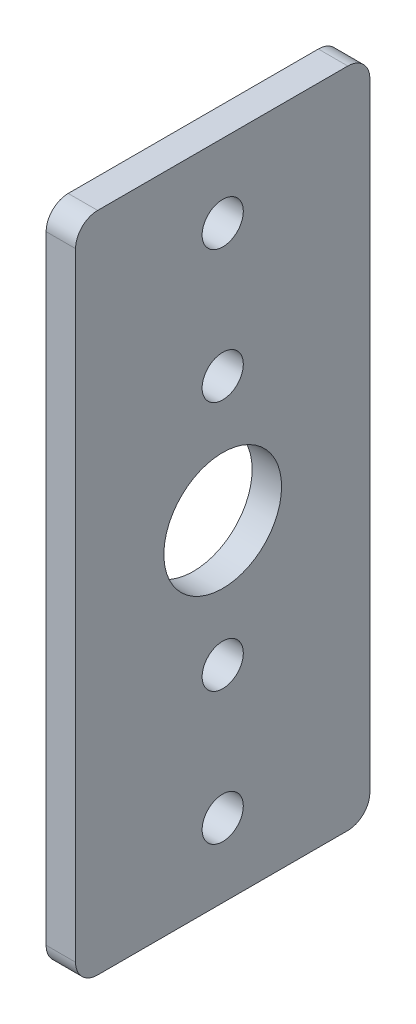
ISO-10303-21;
HEADER;
FILE_DESCRIPTION(('STEP AP214'),'2;1');
FILE_NAME('part.step','',(''),(''),'','','');
FILE_SCHEMA(('AUTOMOTIVE_DESIGN { 1 0 10303 214 1 1 1 1 }'));
ENDSEC;
DATA;
#1=APPLICATION_CONTEXT('core data for automotive mechanical design processes');
#2=APPLICATION_PROTOCOL_DEFINITION('international standard','automotive_design',2000,#1);
#3=PRODUCT_CONTEXT('',#1,'mechanical');
#4=PRODUCT('Part','Part','',(#3));
#5=PRODUCT_RELATED_PRODUCT_CATEGORY('part','',(#4));
#6=PRODUCT_DEFINITION_FORMATION('','',#4);
#7=PRODUCT_DEFINITION_CONTEXT('part definition',#1,'design');
#8=PRODUCT_DEFINITION('design','',#6,#7);
#9=PRODUCT_DEFINITION_SHAPE('','',#8);
#10=(LENGTH_UNIT() NAMED_UNIT(*) SI_UNIT(.MILLI.,.METRE.));
#11=(NAMED_UNIT(*) PLANE_ANGLE_UNIT() SI_UNIT($,.RADIAN.));
#12=(NAMED_UNIT(*) SI_UNIT($,.STERADIAN.) SOLID_ANGLE_UNIT());
#13=UNCERTAINTY_MEASURE_WITH_UNIT(LENGTH_MEASURE(1.E-05),#10,'distance_accuracy_value','');
#14=(GEOMETRIC_REPRESENTATION_CONTEXT(3) GLOBAL_UNCERTAINTY_ASSIGNED_CONTEXT((#13)) GLOBAL_UNIT_ASSIGNED_CONTEXT((#10,
#11,#12)) REPRESENTATION_CONTEXT('',''));
#15=CARTESIAN_POINT('',(0.,0.,0.));
#16=DIRECTION('',(0.,0.,1.));
#17=DIRECTION('',(1.,0.,0.));
#18=AXIS2_PLACEMENT_3D('',#15,#16,#17);
#19=CARTESIAN_POINT('',(2.,0.,0.));
#20=DIRECTION('',(1.,0.,0.));
#21=DIRECTION('',(0.,0.,-1.));
#22=AXIS2_PLACEMENT_3D('',#19,#20,#21);
#23=PLANE('',#22);
#24=CARTESIAN_POINT('',(2.,-72.2566119046528,-0.605906027952761));
#25=DIRECTION('',(1.,0.,0.));
#26=DIRECTION('',(0.,0.,-1.));
#27=AXIS2_PLACEMENT_3D('',#24,#25,#26);
#28=CIRCLE('',#27,1.4);
#29=CARTESIAN_POINT('',(2.,-72.2566119046528,-2.00590602795276));
#30=VERTEX_POINT('',#29);
#31=EDGE_CURVE('E190',#30,#30,#28,.T.);
#32=ORIENTED_EDGE('',*,*,#31,.F.);
#33=EDGE_LOOP('',(#32));
#34=FACE_BOUND('',#33,.T.);
#35=CARTESIAN_POINT('',(2.,-46.2566119046528,-0.605906027952761));
#36=DIRECTION('',(1.,0.,0.));
#37=DIRECTION('',(0.,0.,-1.));
#38=AXIS2_PLACEMENT_3D('',#35,#36,#37);
#39=CIRCLE('',#38,1.4);
#40=CARTESIAN_POINT('',(2.,-46.2566119046528,-2.00590602795276));
#41=VERTEX_POINT('',#40);
#42=EDGE_CURVE('E179',#41,#41,#39,.T.);
#43=ORIENTED_EDGE('',*,*,#42,.F.);
#44=EDGE_LOOP('',(#43));
#45=FACE_BOUND('',#44,.T.);
#46=DIRECTION('',(0.,1.,0.));
#47=VECTOR('',#46,1.);
#48=CARTESIAN_POINT('',(2.,-41.2566119046528,-10.6059060279527));
#49=LINE('',#48,#47);
#50=CARTESIAN_POINT('',(2.,-84.7566119046528,-10.6059060279527));
#51=VERTEX_POINT('',#50);
#52=CARTESIAN_POINT('',(2.,-42.7566119046528,-10.6059060279527));
#53=VERTEX_POINT('',#52);
#54=EDGE_CURVE('E174',#51,#53,#49,.T.);
#55=ORIENTED_EDGE('',*,*,#54,.T.);
#56=CARTESIAN_POINT('',(2.,-42.7566119046528,-9.10590602795275));
#57=DIRECTION('',(1.,0.,0.));
#58=DIRECTION('',(0.,0.,-1.));
#59=AXIS2_PLACEMENT_3D('',#56,#57,#58);
#60=CIRCLE('',#59,1.5);
#61=CARTESIAN_POINT('',(2.,-41.2566119046528,-9.10590602795274));
#62=VERTEX_POINT('',#61);
#63=EDGE_CURVE('E151',#53,#62,#60,.T.);
#64=ORIENTED_EDGE('',*,*,#63,.T.);
#65=DIRECTION('',(0.,0.,1.));
#66=VECTOR('',#65,1.);
#67=CARTESIAN_POINT('',(2.,-41.2566119046528,9.39409397204723));
#68=LINE('',#67,#66);
#69=CARTESIAN_POINT('',(2.,-41.2566119046528,7.89409397204723));
#70=VERTEX_POINT('',#69);
#71=EDGE_CURVE('E122',#62,#70,#68,.T.);
#72=ORIENTED_EDGE('',*,*,#71,.T.);
#73=CARTESIAN_POINT('',(2.,-42.7566119046528,7.89409397204723));
#74=DIRECTION('',(1.,0.,0.));
#75=DIRECTION('',(0.,0.,-1.));
#76=AXIS2_PLACEMENT_3D('',#73,#74,#75);
#77=CIRCLE('',#76,1.5);
#78=CARTESIAN_POINT('',(2.,-42.7566119046528,9.39409397204723));
#79=VERTEX_POINT('',#78);
#80=EDGE_CURVE('E149',#70,#79,#77,.T.);
#81=ORIENTED_EDGE('',*,*,#80,.T.);
#82=DIRECTION('',(0.,-1.,0.));
#83=VECTOR('',#82,1.);
#84=CARTESIAN_POINT('',(2.,-41.2566119046528,9.39409397204723));
#85=LINE('',#84,#83);
#86=CARTESIAN_POINT('',(2.,-84.7566119046528,9.39409397204723));
#87=VERTEX_POINT('',#86);
#88=EDGE_CURVE('E129',#79,#87,#85,.T.);
#89=ORIENTED_EDGE('',*,*,#88,.T.);
#90=CARTESIAN_POINT('',(2.,-84.7566119046528,7.89409397204723));
#91=DIRECTION('',(1.,0.,0.));
#92=DIRECTION('',(0.,0.,-1.));
#93=AXIS2_PLACEMENT_3D('',#90,#91,#92);
#94=CIRCLE('',#93,1.5);
#95=CARTESIAN_POINT('',(2.,-86.2566119046528,7.89409397204723));
#96=VERTEX_POINT('',#95);
#97=EDGE_CURVE('E57',#87,#96,#94,.T.);
#98=ORIENTED_EDGE('',*,*,#97,.T.);
#99=DIRECTION('',(0.,0.,-1.));
#100=VECTOR('',#99,1.);
#101=CARTESIAN_POINT('',(2.,-86.2566119046528,9.39409397204723));
#102=LINE('',#101,#100);
#103=CARTESIAN_POINT('',(2.,-86.2566119046528,-9.10590602795274));
#104=VERTEX_POINT('',#103);
#105=EDGE_CURVE('E132',#96,#104,#102,.T.);
#106=ORIENTED_EDGE('',*,*,#105,.T.);
#107=CARTESIAN_POINT('',(2.,-84.7566119046528,-9.10590602795275));
#108=DIRECTION('',(1.,0.,0.));
#109=DIRECTION('',(0.,0.,-1.));
#110=AXIS2_PLACEMENT_3D('',#107,#108,#109);
#111=CIRCLE('',#110,1.5);
#112=EDGE_CURVE('E146',#104,#51,#111,.T.);
#113=ORIENTED_EDGE('',*,*,#112,.T.);
#114=EDGE_LOOP('',(#55,#64,#72,#81,#89,#98,#106,#113));
#115=FACE_BOUND('',#114,.T.);
#116=CARTESIAN_POINT('',(2.,-63.7566119046528,-0.605906027952761));
#117=DIRECTION('',(1.,0.,0.));
#118=DIRECTION('',(0.,0.,-1.));
#119=AXIS2_PLACEMENT_3D('',#116,#117,#118);
#120=CIRCLE('',#119,4.);
#121=CARTESIAN_POINT('',(2.,-63.7566119046528,-4.60590602795276));
#122=VERTEX_POINT('',#121);
#123=EDGE_CURVE('E167',#122,#122,#120,.T.);
#124=ORIENTED_EDGE('',*,*,#123,.F.);
#125=EDGE_LOOP('',(#124));
#126=FACE_BOUND('',#125,.T.);
#127=CARTESIAN_POINT('',(2.,-55.2566119046528,-0.605906027952761));
#128=DIRECTION('',(1.,0.,0.));
#129=DIRECTION('',(0.,0.,-1.));
#130=AXIS2_PLACEMENT_3D('',#127,#128,#129);
#131=CIRCLE('',#130,1.4);
#132=CARTESIAN_POINT('',(2.,-55.2566119046528,-2.00590602795276));
#133=VERTEX_POINT('',#132);
#134=EDGE_CURVE('E184',#133,#133,#131,.T.);
#135=ORIENTED_EDGE('',*,*,#134,.F.);
#136=EDGE_LOOP('',(#135));
#137=FACE_BOUND('',#136,.T.);
#138=CARTESIAN_POINT('',(2.,-81.2566119046528,-0.605906027952761));
#139=DIRECTION('',(1.,0.,0.));
#140=DIRECTION('',(0.,0.,-1.));
#141=AXIS2_PLACEMENT_3D('',#138,#139,#140);
#142=CIRCLE('',#141,1.4);
#143=CARTESIAN_POINT('',(2.,-81.2566119046528,-2.00590602795276));
#144=VERTEX_POINT('',#143);
#145=EDGE_CURVE('E196',#144,#144,#142,.T.);
#146=ORIENTED_EDGE('',*,*,#145,.F.);
#147=EDGE_LOOP('',(#146));
#148=FACE_BOUND('',#147,.T.);
#149=ADVANCED_FACE('F36',(#34,#45,#115,#126,#137,#148),#23,.T.);
#150=CARTESIAN_POINT('',(0.,0.,0.));
#151=DIRECTION('',(1.,0.,0.));
#152=DIRECTION('',(0.,0.,-1.));
#153=AXIS2_PLACEMENT_3D('',#150,#151,#152);
#154=PLANE('',#153);
#155=DIRECTION('',(0.,0.,1.));
#156=VECTOR('',#155,1.);
#157=CARTESIAN_POINT('',(0.,-41.2566119046528,9.39409397204723));
#158=LINE('',#157,#156);
#159=CARTESIAN_POINT('',(0.,-41.2566119046528,-9.10590602795274));
#160=VERTEX_POINT('',#159);
#161=CARTESIAN_POINT('',(0.,-41.2566119046528,7.89409397204723));
#162=VERTEX_POINT('',#161);
#163=EDGE_CURVE('E119',#160,#162,#158,.T.);
#164=ORIENTED_EDGE('',*,*,#163,.F.);
#165=CARTESIAN_POINT('',(0.,-42.7566119046528,-9.10590602795275));
#166=DIRECTION('',(1.,0.,0.));
#167=DIRECTION('',(0.,0.,-1.));
#168=AXIS2_PLACEMENT_3D('',#165,#166,#167);
#169=CIRCLE('',#168,1.5);
#170=CARTESIAN_POINT('',(0.,-42.7566119046528,-10.6059060279527));
#171=VERTEX_POINT('',#170);
#172=EDGE_CURVE('E102',#160,#171,#169,.F.);
#173=ORIENTED_EDGE('',*,*,#172,.T.);
#174=DIRECTION('',(0.,1.,0.));
#175=VECTOR('',#174,1.);
#176=CARTESIAN_POINT('',(0.,-41.2566119046528,-10.6059060279527));
#177=LINE('',#176,#175);
#178=CARTESIAN_POINT('',(0.,-84.7566119046528,-10.6059060279527));
#179=VERTEX_POINT('',#178);
#180=EDGE_CURVE('E130',#179,#171,#177,.T.);
#181=ORIENTED_EDGE('',*,*,#180,.F.);
#182=CARTESIAN_POINT('',(0.,-84.7566119046528,-9.10590602795275));
#183=DIRECTION('',(1.,0.,0.));
#184=DIRECTION('',(0.,0.,-1.));
#185=AXIS2_PLACEMENT_3D('',#182,#183,#184);
#186=CIRCLE('',#185,1.5);
#187=CARTESIAN_POINT('',(0.,-86.2566119046528,-9.10590602795274));
#188=VERTEX_POINT('',#187);
#189=EDGE_CURVE('E123',#179,#188,#186,.F.);
#190=ORIENTED_EDGE('',*,*,#189,.T.);
#191=DIRECTION('',(0.,0.,-1.));
#192=VECTOR('',#191,1.);
#193=CARTESIAN_POINT('',(0.,-86.2566119046528,9.39409397204723));
#194=LINE('',#193,#192);
#195=CARTESIAN_POINT('',(0.,-86.2566119046528,7.89409397204723));
#196=VERTEX_POINT('',#195);
#197=EDGE_CURVE('E134',#196,#188,#194,.T.);
#198=ORIENTED_EDGE('',*,*,#197,.F.);
#199=CARTESIAN_POINT('',(0.,-84.7566119046528,7.89409397204723));
#200=DIRECTION('',(1.,0.,0.));
#201=DIRECTION('',(0.,0.,-1.));
#202=AXIS2_PLACEMENT_3D('',#199,#200,#201);
#203=CIRCLE('',#202,1.5);
#204=CARTESIAN_POINT('',(0.,-84.7566119046528,9.39409397204723));
#205=VERTEX_POINT('',#204);
#206=EDGE_CURVE('E140',#196,#205,#203,.F.);
#207=ORIENTED_EDGE('',*,*,#206,.T.);
#208=DIRECTION('',(0.,-1.,0.));
#209=VECTOR('',#208,1.);
#210=CARTESIAN_POINT('',(0.,-41.2566119046528,9.39409397204723));
#211=LINE('',#210,#209);
#212=CARTESIAN_POINT('',(0.,-42.7566119046528,9.39409397204723));
#213=VERTEX_POINT('',#212);
#214=EDGE_CURVE('E162',#213,#205,#211,.T.);
#215=ORIENTED_EDGE('',*,*,#214,.F.);
#216=CARTESIAN_POINT('',(0.,-42.7566119046528,7.89409397204723));
#217=DIRECTION('',(1.,0.,0.));
#218=DIRECTION('',(0.,0.,-1.));
#219=AXIS2_PLACEMENT_3D('',#216,#217,#218);
#220=CIRCLE('',#219,1.5);
#221=EDGE_CURVE('E113',#213,#162,#220,.F.);
#222=ORIENTED_EDGE('',*,*,#221,.T.);
#223=EDGE_LOOP('',(#164,#173,#181,#190,#198,#207,#215,#222));
#224=FACE_BOUND('',#223,.T.);
#225=CARTESIAN_POINT('',(0.,-63.7566119046528,-0.605906027952761));
#226=DIRECTION('',(1.,0.,0.));
#227=DIRECTION('',(0.,0.,-1.));
#228=AXIS2_PLACEMENT_3D('',#225,#226,#227);
#229=CIRCLE('',#228,4.);
#230=CARTESIAN_POINT('',(0.,-63.7566119046528,-4.60590602795276));
#231=VERTEX_POINT('',#230);
#232=EDGE_CURVE('E170',#231,#231,#229,.T.);
#233=ORIENTED_EDGE('',*,*,#232,.T.);
#234=EDGE_LOOP('',(#233));
#235=FACE_BOUND('',#234,.T.);
#236=CARTESIAN_POINT('',(0.,-46.2566119046528,-0.605906027952761));
#237=DIRECTION('',(1.,0.,0.));
#238=DIRECTION('',(0.,0.,-1.));
#239=AXIS2_PLACEMENT_3D('',#236,#237,#238);
#240=CIRCLE('',#239,1.4);
#241=CARTESIAN_POINT('',(0.,-46.2566119046528,-2.00590602795276));
#242=VERTEX_POINT('',#241);
#243=EDGE_CURVE('E181',#242,#242,#240,.T.);
#244=ORIENTED_EDGE('',*,*,#243,.T.);
#245=EDGE_LOOP('',(#244));
#246=FACE_BOUND('',#245,.T.);
#247=CARTESIAN_POINT('',(0.,-55.2566119046528,-0.605906027952761));
#248=DIRECTION('',(1.,0.,0.));
#249=DIRECTION('',(0.,0.,-1.));
#250=AXIS2_PLACEMENT_3D('',#247,#248,#249);
#251=CIRCLE('',#250,1.4);
#252=CARTESIAN_POINT('',(0.,-55.2566119046528,-2.00590602795276));
#253=VERTEX_POINT('',#252);
#254=EDGE_CURVE('E187',#253,#253,#251,.T.);
#255=ORIENTED_EDGE('',*,*,#254,.T.);
#256=EDGE_LOOP('',(#255));
#257=FACE_BOUND('',#256,.T.);
#258=CARTESIAN_POINT('',(0.,-72.2566119046528,-0.605906027952761));
#259=DIRECTION('',(1.,0.,0.));
#260=DIRECTION('',(0.,0.,-1.));
#261=AXIS2_PLACEMENT_3D('',#258,#259,#260);
#262=CIRCLE('',#261,1.4);
#263=CARTESIAN_POINT('',(0.,-72.2566119046528,-2.00590602795276));
#264=VERTEX_POINT('',#263);
#265=EDGE_CURVE('E193',#264,#264,#262,.T.);
#266=ORIENTED_EDGE('',*,*,#265,.T.);
#267=EDGE_LOOP('',(#266));
#268=FACE_BOUND('',#267,.T.);
#269=CARTESIAN_POINT('',(0.,-81.2566119046528,-0.605906027952761));
#270=DIRECTION('',(1.,0.,0.));
#271=DIRECTION('',(0.,0.,-1.));
#272=AXIS2_PLACEMENT_3D('',#269,#270,#271);
#273=CIRCLE('',#272,1.4);
#274=CARTESIAN_POINT('',(0.,-81.2566119046528,-2.00590602795276));
#275=VERTEX_POINT('',#274);
#276=EDGE_CURVE('E199',#275,#275,#273,.T.);
#277=ORIENTED_EDGE('',*,*,#276,.T.);
#278=EDGE_LOOP('',(#277));
#279=FACE_BOUND('',#278,.T.);
#280=ADVANCED_FACE('F126',(#224,#235,#246,#257,#268,#279),#154,.F.);
#281=CARTESIAN_POINT('',(2.,-41.2566119046528,9.39409397204723));
#282=DIRECTION('',(0.,0.,-1.));
#283=DIRECTION('',(-1.,0.,0.));
#284=AXIS2_PLACEMENT_3D('',#281,#282,#283);
#285=PLANE('',#284);
#286=ORIENTED_EDGE('',*,*,#88,.F.);
#287=DIRECTION('',(-1.,0.,0.));
#288=VECTOR('',#287,1.);
#289=CARTESIAN_POINT('',(2.,-42.7566119046528,9.39409397204723));
#290=LINE('',#289,#288);
#291=EDGE_CURVE('E155',#79,#213,#290,.T.);
#292=ORIENTED_EDGE('',*,*,#291,.T.);
#293=ORIENTED_EDGE('',*,*,#214,.T.);
#294=DIRECTION('',(-1.,0.,0.));
#295=VECTOR('',#294,1.);
#296=CARTESIAN_POINT('',(2.,-84.7566119046528,9.39409397204723));
#297=LINE('',#296,#295);
#298=EDGE_CURVE('E153',#205,#87,#297,.F.);
#299=ORIENTED_EDGE('',*,*,#298,.T.);
#300=EDGE_LOOP('',(#286,#292,#293,#299));
#301=FACE_BOUND('',#300,.T.);
#302=ADVANCED_FACE('F161',(#301),#285,.F.);
#303=CARTESIAN_POINT('',(2.,-86.2566119046528,9.39409397204723));
#304=DIRECTION('',(0.,1.,0.));
#305=DIRECTION('',(0.,0.,1.));
#306=AXIS2_PLACEMENT_3D('',#303,#304,#305);
#307=PLANE('',#306);
#308=ORIENTED_EDGE('',*,*,#105,.F.);
#309=DIRECTION('',(-1.,0.,0.));
#310=VECTOR('',#309,1.);
#311=CARTESIAN_POINT('',(2.,-86.2566119046528,7.89409397204723));
#312=LINE('',#311,#310);
#313=EDGE_CURVE('E11',#96,#196,#312,.T.);
#314=ORIENTED_EDGE('',*,*,#313,.T.);
#315=ORIENTED_EDGE('',*,*,#197,.T.);
#316=DIRECTION('',(-1.,0.,0.));
#317=VECTOR('',#316,1.);
#318=CARTESIAN_POINT('',(2.,-86.2566119046528,-9.10590602795275));
#319=LINE('',#318,#317);
#320=EDGE_CURVE('E44',#188,#104,#319,.F.);
#321=ORIENTED_EDGE('',*,*,#320,.T.);
#322=EDGE_LOOP('',(#308,#314,#315,#321));
#323=FACE_BOUND('',#322,.T.);
#324=ADVANCED_FACE('F226',(#323),#307,.F.);
#325=CARTESIAN_POINT('',(2.,-41.2566119046528,-10.6059060279527));
#326=DIRECTION('',(0.,0.,1.));
#327=DIRECTION('',(1.,0.,0.));
#328=AXIS2_PLACEMENT_3D('',#325,#326,#327);
#329=PLANE('',#328);
#330=ORIENTED_EDGE('',*,*,#180,.T.);
#331=DIRECTION('',(-1.,0.,0.));
#332=VECTOR('',#331,1.);
#333=CARTESIAN_POINT('',(2.,-42.7566119046528,-10.6059060279527));
#334=LINE('',#333,#332);
#335=EDGE_CURVE('E107',#171,#53,#334,.F.);
#336=ORIENTED_EDGE('',*,*,#335,.T.);
#337=ORIENTED_EDGE('',*,*,#54,.F.);
#338=DIRECTION('',(-1.,0.,0.));
#339=VECTOR('',#338,1.);
#340=CARTESIAN_POINT('',(2.,-84.7566119046528,-10.6059060279527));
#341=LINE('',#340,#339);
#342=EDGE_CURVE('E112',#51,#179,#341,.T.);
#343=ORIENTED_EDGE('',*,*,#342,.T.);
#344=EDGE_LOOP('',(#330,#336,#337,#343));
#345=FACE_BOUND('',#344,.T.);
#346=ADVANCED_FACE('F223',(#345),#329,.F.);
#347=CARTESIAN_POINT('',(2.,-41.2566119046528,9.39409397204723));
#348=DIRECTION('',(0.,-1.,0.));
#349=DIRECTION('',(0.,0.,-1.));
#350=AXIS2_PLACEMENT_3D('',#347,#348,#349);
#351=PLANE('',#350);
#352=ORIENTED_EDGE('',*,*,#71,.F.);
#353=DIRECTION('',(-1.,0.,0.));
#354=VECTOR('',#353,1.);
#355=CARTESIAN_POINT('',(2.,-41.2566119046528,-9.10590602795275));
#356=LINE('',#355,#354);
#357=EDGE_CURVE('E106',#62,#160,#356,.T.);
#358=ORIENTED_EDGE('',*,*,#357,.T.);
#359=ORIENTED_EDGE('',*,*,#163,.T.);
#360=DIRECTION('',(-1.,0.,0.));
#361=VECTOR('',#360,1.);
#362=CARTESIAN_POINT('',(2.,-41.2566119046528,7.89409397204723));
#363=LINE('',#362,#361);
#364=EDGE_CURVE('E124',#162,#70,#363,.F.);
#365=ORIENTED_EDGE('',*,*,#364,.T.);
#366=EDGE_LOOP('',(#352,#358,#359,#365));
#367=FACE_BOUND('',#366,.T.);
#368=ADVANCED_FACE('F118',(#367),#351,.F.);
#369=CARTESIAN_POINT('',(2.,-63.7566119046528,-0.605906027952761));
#370=DIRECTION('',(-1.,0.,0.));
#371=DIRECTION('',(0.,0.,1.));
#372=AXIS2_PLACEMENT_3D('',#369,#370,#371);
#373=CYLINDRICAL_SURFACE('',#372,4.);
#374=ORIENTED_EDGE('',*,*,#123,.T.);
#375=EDGE_LOOP('',(#374));
#376=FACE_BOUND('',#375,.T.);
#377=ORIENTED_EDGE('',*,*,#232,.F.);
#378=EDGE_LOOP('',(#377));
#379=FACE_BOUND('',#378,.T.);
#380=ADVANCED_FACE('F218',(#376,#379),#373,.F.);
#381=CARTESIAN_POINT('',(2.,-46.2566119046528,-0.605906027952761));
#382=DIRECTION('',(-1.,0.,0.));
#383=DIRECTION('',(0.,0.,1.));
#384=AXIS2_PLACEMENT_3D('',#381,#382,#383);
#385=CYLINDRICAL_SURFACE('',#384,1.4);
#386=ORIENTED_EDGE('',*,*,#42,.T.);
#387=EDGE_LOOP('',(#386));
#388=FACE_BOUND('',#387,.T.);
#389=ORIENTED_EDGE('',*,*,#243,.F.);
#390=EDGE_LOOP('',(#389));
#391=FACE_BOUND('',#390,.T.);
#392=ADVANCED_FACE('F256',(#388,#391),#385,.F.);
#393=CARTESIAN_POINT('',(2.,-55.2566119046528,-0.605906027952761));
#394=DIRECTION('',(-1.,0.,0.));
#395=DIRECTION('',(0.,0.,1.));
#396=AXIS2_PLACEMENT_3D('',#393,#394,#395);
#397=CYLINDRICAL_SURFACE('',#396,1.4);
#398=ORIENTED_EDGE('',*,*,#134,.T.);
#399=EDGE_LOOP('',(#398));
#400=FACE_BOUND('',#399,.T.);
#401=ORIENTED_EDGE('',*,*,#254,.F.);
#402=EDGE_LOOP('',(#401));
#403=FACE_BOUND('',#402,.T.);
#404=ADVANCED_FACE('F252',(#400,#403),#397,.F.);
#405=CARTESIAN_POINT('',(2.,-72.2566119046528,-0.605906027952761));
#406=DIRECTION('',(-1.,0.,0.));
#407=DIRECTION('',(0.,0.,1.));
#408=AXIS2_PLACEMENT_3D('',#405,#406,#407);
#409=CYLINDRICAL_SURFACE('',#408,1.4);
#410=ORIENTED_EDGE('',*,*,#31,.T.);
#411=EDGE_LOOP('',(#410));
#412=FACE_BOUND('',#411,.T.);
#413=ORIENTED_EDGE('',*,*,#265,.F.);
#414=EDGE_LOOP('',(#413));
#415=FACE_BOUND('',#414,.T.);
#416=ADVANCED_FACE('F255',(#412,#415),#409,.F.);
#417=CARTESIAN_POINT('',(2.,-81.2566119046528,-0.605906027952761));
#418=DIRECTION('',(-1.,0.,0.));
#419=DIRECTION('',(0.,0.,1.));
#420=AXIS2_PLACEMENT_3D('',#417,#418,#419);
#421=CYLINDRICAL_SURFACE('',#420,1.4);
#422=ORIENTED_EDGE('',*,*,#145,.T.);
#423=EDGE_LOOP('',(#422));
#424=FACE_BOUND('',#423,.T.);
#425=ORIENTED_EDGE('',*,*,#276,.F.);
#426=EDGE_LOOP('',(#425));
#427=FACE_BOUND('',#426,.T.);
#428=ADVANCED_FACE('F205',(#424,#427),#421,.F.);
#429=CARTESIAN_POINT('',(2.,-42.7566119046528,-9.10590602795275));
#430=DIRECTION('',(-1.,0.,0.));
#431=DIRECTION('',(0.,0.,1.));
#432=AXIS2_PLACEMENT_3D('',#429,#430,#431);
#433=CYLINDRICAL_SURFACE('',#432,1.5);
#434=ORIENTED_EDGE('',*,*,#63,.F.);
#435=ORIENTED_EDGE('',*,*,#335,.F.);
#436=ORIENTED_EDGE('',*,*,#172,.F.);
#437=ORIENTED_EDGE('',*,*,#357,.F.);
#438=EDGE_LOOP('',(#434,#435,#436,#437));
#439=FACE_BOUND('',#438,.T.);
#440=ADVANCED_FACE('F105',(#439),#433,.T.);
#441=CARTESIAN_POINT('',(2.,-42.7566119046528,7.89409397204723));
#442=DIRECTION('',(-1.,0.,0.));
#443=DIRECTION('',(0.,0.,1.));
#444=AXIS2_PLACEMENT_3D('',#441,#442,#443);
#445=CYLINDRICAL_SURFACE('',#444,1.5);
#446=ORIENTED_EDGE('',*,*,#80,.F.);
#447=ORIENTED_EDGE('',*,*,#364,.F.);
#448=ORIENTED_EDGE('',*,*,#221,.F.);
#449=ORIENTED_EDGE('',*,*,#291,.F.);
#450=EDGE_LOOP('',(#446,#447,#448,#449));
#451=FACE_BOUND('',#450,.T.);
#452=ADVANCED_FACE('F234',(#451),#445,.T.);
#453=CARTESIAN_POINT('',(2.,-84.7566119046528,7.89409397204723));
#454=DIRECTION('',(-1.,0.,0.));
#455=DIRECTION('',(0.,0.,1.));
#456=AXIS2_PLACEMENT_3D('',#453,#454,#455);
#457=CYLINDRICAL_SURFACE('',#456,1.5);
#458=ORIENTED_EDGE('',*,*,#97,.F.);
#459=ORIENTED_EDGE('',*,*,#298,.F.);
#460=ORIENTED_EDGE('',*,*,#206,.F.);
#461=ORIENTED_EDGE('',*,*,#313,.F.);
#462=EDGE_LOOP('',(#458,#459,#460,#461));
#463=FACE_BOUND('',#462,.T.);
#464=ADVANCED_FACE('F236',(#463),#457,.T.);
#465=CARTESIAN_POINT('',(2.,-84.7566119046528,-9.10590602795275));
#466=DIRECTION('',(-1.,0.,0.));
#467=DIRECTION('',(0.,0.,1.));
#468=AXIS2_PLACEMENT_3D('',#465,#466,#467);
#469=CYLINDRICAL_SURFACE('',#468,1.5);
#470=ORIENTED_EDGE('',*,*,#112,.F.);
#471=ORIENTED_EDGE('',*,*,#320,.F.);
#472=ORIENTED_EDGE('',*,*,#189,.F.);
#473=ORIENTED_EDGE('',*,*,#342,.F.);
#474=EDGE_LOOP('',(#470,#471,#472,#473));
#475=FACE_BOUND('',#474,.T.);
#476=ADVANCED_FACE('F38',(#475),#469,.T.);
#477=CLOSED_SHELL('',(#149,#280,#302,#324,#346,#368,#380,#392,#404,#416,#428,#440,#452,#464,#476));
#478=MANIFOLD_SOLID_BREP('B2',#477);
#479=ADVANCED_BREP_SHAPE_REPRESENTATION('',(#18,#478),#14);
#480=SHAPE_DEFINITION_REPRESENTATION(#9,#479);
ENDSEC;
END-ISO-10303-21;
